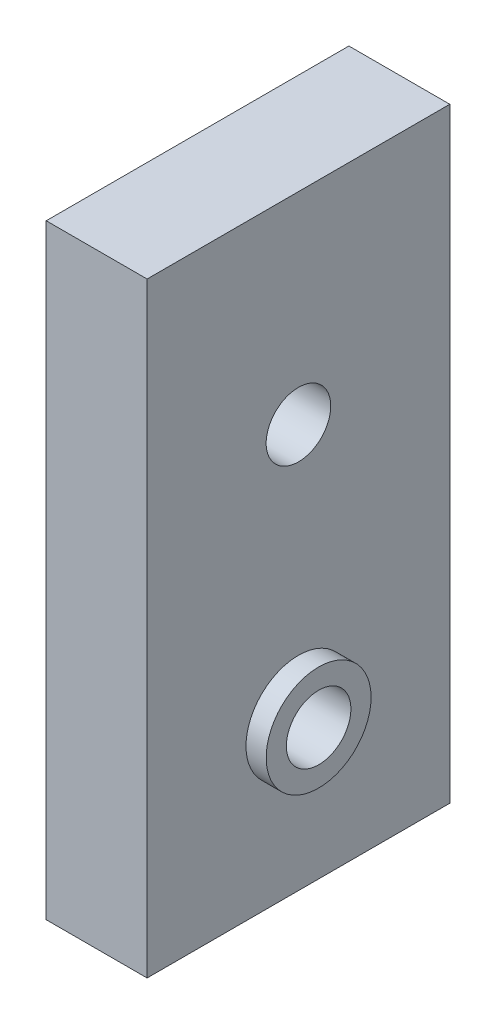
ISO-10303-21;
HEADER;
FILE_DESCRIPTION(('STEP AP214'),'2;1');
FILE_NAME('part.step','',(''),(''),'','','');
FILE_SCHEMA(('AUTOMOTIVE_DESIGN { 1 0 10303 214 1 1 1 1 }'));
ENDSEC;
DATA;
#1=APPLICATION_CONTEXT('core data for automotive mechanical design processes');
#2=APPLICATION_PROTOCOL_DEFINITION('international standard','automotive_design',2000,#1);
#3=PRODUCT_CONTEXT('',#1,'mechanical');
#4=PRODUCT('Part','Part','',(#3));
#5=PRODUCT_RELATED_PRODUCT_CATEGORY('part','',(#4));
#6=PRODUCT_DEFINITION_FORMATION('','',#4);
#7=PRODUCT_DEFINITION_CONTEXT('part definition',#1,'design');
#8=PRODUCT_DEFINITION('design','',#6,#7);
#9=PRODUCT_DEFINITION_SHAPE('','',#8);
#10=(LENGTH_UNIT() NAMED_UNIT(*) SI_UNIT(.MILLI.,.METRE.));
#11=(NAMED_UNIT(*) PLANE_ANGLE_UNIT() SI_UNIT($,.RADIAN.));
#12=(NAMED_UNIT(*) SI_UNIT($,.STERADIAN.) SOLID_ANGLE_UNIT());
#13=UNCERTAINTY_MEASURE_WITH_UNIT(LENGTH_MEASURE(1.E-05),#10,'distance_accuracy_value','');
#14=(GEOMETRIC_REPRESENTATION_CONTEXT(3) GLOBAL_UNCERTAINTY_ASSIGNED_CONTEXT((#13)) GLOBAL_UNIT_ASSIGNED_CONTEXT((#10,
#11,#12)) REPRESENTATION_CONTEXT('',''));
#15=CARTESIAN_POINT('',(0.,0.,0.));
#16=DIRECTION('',(0.,0.,1.));
#17=DIRECTION('',(1.,0.,0.));
#18=AXIS2_PLACEMENT_3D('',#15,#16,#17);
#19=CARTESIAN_POINT('',(5.,0.,0.));
#20=DIRECTION('',(1.,0.,0.));
#21=DIRECTION('',(0.,0.,-1.));
#22=AXIS2_PLACEMENT_3D('',#19,#20,#21);
#23=PLANE('',#22);
#24=CARTESIAN_POINT('',(5.,20.,-7.5));
#25=DIRECTION('',(1.,0.,0.));
#26=DIRECTION('',(0.,0.,-1.));
#27=AXIS2_PLACEMENT_3D('',#24,#25,#26);
#28=CIRCLE('',#27,1.6);
#29=CARTESIAN_POINT('',(5.,20.,-9.1));
#30=VERTEX_POINT('',#29);
#31=EDGE_CURVE('E105',#30,#30,#28,.T.);
#32=ORIENTED_EDGE('',*,*,#31,.F.);
#33=EDGE_LOOP('',(#32));
#34=FACE_BOUND('',#33,.T.);
#35=DIRECTION('',(0.,1.,0.));
#36=VECTOR('',#35,1.);
#37=CARTESIAN_POINT('',(5.,0.,0.));
#38=LINE('',#37,#36);
#39=CARTESIAN_POINT('',(5.,0.,0.));
#40=VERTEX_POINT('',#39);
#41=CARTESIAN_POINT('',(5.,30.,0.));
#42=VERTEX_POINT('',#41);
#43=EDGE_CURVE('E96',#40,#42,#38,.T.);
#44=ORIENTED_EDGE('',*,*,#43,.F.);
#45=DIRECTION('',(0.,0.,-1.));
#46=VECTOR('',#45,1.);
#47=CARTESIAN_POINT('',(5.,0.,0.));
#48=LINE('',#47,#46);
#49=CARTESIAN_POINT('',(5.,0.,-15.));
#50=VERTEX_POINT('',#49);
#51=EDGE_CURVE('E92',#40,#50,#48,.T.);
#52=ORIENTED_EDGE('',*,*,#51,.T.);
#53=DIRECTION('',(0.,1.,0.));
#54=VECTOR('',#53,1.);
#55=CARTESIAN_POINT('',(5.,0.,-15.));
#56=LINE('',#55,#54);
#57=CARTESIAN_POINT('',(5.,30.,-15.));
#58=VERTEX_POINT('',#57);
#59=EDGE_CURVE('E84',#50,#58,#56,.T.);
#60=ORIENTED_EDGE('',*,*,#59,.T.);
#61=DIRECTION('',(0.,0.,-1.));
#62=VECTOR('',#61,1.);
#63=CARTESIAN_POINT('',(5.,30.,0.));
#64=LINE('',#63,#62);
#65=EDGE_CURVE('E91',#42,#58,#64,.T.);
#66=ORIENTED_EDGE('',*,*,#65,.F.);
#67=EDGE_LOOP('',(#44,#52,#60,#66));
#68=FACE_BOUND('',#67,.T.);
#69=CARTESIAN_POINT('',(5.,7.5,-7.5));
#70=DIRECTION('',(1.,0.,0.));
#71=DIRECTION('',(0.,0.,-1.));
#72=AXIS2_PLACEMENT_3D('',#69,#70,#71);
#73=CIRCLE('',#72,2.6);
#74=CARTESIAN_POINT('',(5.,7.5,-10.1));
#75=VERTEX_POINT('',#74);
#76=EDGE_CURVE('E125',#75,#75,#73,.T.);
#77=ORIENTED_EDGE('',*,*,#76,.F.);
#78=EDGE_LOOP('',(#77));
#79=FACE_BOUND('',#78,.T.);
#80=ADVANCED_FACE('F41',(#34,#68,#79),#23,.T.);
#81=CARTESIAN_POINT('',(5.,0.,0.));
#82=DIRECTION('',(0.,0.,1.));
#83=DIRECTION('',(1.,0.,0.));
#84=AXIS2_PLACEMENT_3D('',#81,#82,#83);
#85=PLANE('',#84);
#86=DIRECTION('',(0.,1.,0.));
#87=VECTOR('',#86,1.);
#88=CARTESIAN_POINT('',(0.,0.,0.));
#89=LINE('',#88,#87);
#90=CARTESIAN_POINT('',(0.,0.,0.));
#91=VERTEX_POINT('',#90);
#92=CARTESIAN_POINT('',(0.,30.,0.));
#93=VERTEX_POINT('',#92);
#94=EDGE_CURVE('E115',#91,#93,#89,.T.);
#95=ORIENTED_EDGE('',*,*,#94,.F.);
#96=DIRECTION('',(-1.,0.,0.));
#97=VECTOR('',#96,1.);
#98=CARTESIAN_POINT('',(5.,0.,0.));
#99=LINE('',#98,#97);
#100=EDGE_CURVE('E12',#40,#91,#99,.T.);
#101=ORIENTED_EDGE('',*,*,#100,.F.);
#102=ORIENTED_EDGE('',*,*,#43,.T.);
#103=DIRECTION('',(-1.,0.,0.));
#104=VECTOR('',#103,1.);
#105=CARTESIAN_POINT('',(5.,30.,0.));
#106=LINE('',#105,#104);
#107=EDGE_CURVE('E58',#42,#93,#106,.T.);
#108=ORIENTED_EDGE('',*,*,#107,.T.);
#109=EDGE_LOOP('',(#95,#101,#102,#108));
#110=FACE_BOUND('',#109,.T.);
#111=ADVANCED_FACE('F151',(#110),#85,.T.);
#112=CARTESIAN_POINT('',(5.,0.,0.));
#113=DIRECTION('',(0.,1.,0.));
#114=DIRECTION('',(0.,0.,1.));
#115=AXIS2_PLACEMENT_3D('',#112,#113,#114);
#116=PLANE('',#115);
#117=DIRECTION('',(0.,0.,-1.));
#118=VECTOR('',#117,1.);
#119=CARTESIAN_POINT('',(0.,0.,0.));
#120=LINE('',#119,#118);
#121=CARTESIAN_POINT('',(0.,0.,-15.));
#122=VERTEX_POINT('',#121);
#123=EDGE_CURVE('E101',#91,#122,#120,.T.);
#124=ORIENTED_EDGE('',*,*,#123,.T.);
#125=DIRECTION('',(-1.,0.,0.));
#126=VECTOR('',#125,1.);
#127=CARTESIAN_POINT('',(5.,0.,-15.));
#128=LINE('',#127,#126);
#129=EDGE_CURVE('E50',#50,#122,#128,.T.);
#130=ORIENTED_EDGE('',*,*,#129,.F.);
#131=ORIENTED_EDGE('',*,*,#51,.F.);
#132=ORIENTED_EDGE('',*,*,#100,.T.);
#133=EDGE_LOOP('',(#124,#130,#131,#132));
#134=FACE_BOUND('',#133,.T.);
#135=ADVANCED_FACE('F99',(#134),#116,.F.);
#136=CARTESIAN_POINT('',(5.,0.,-15.));
#137=DIRECTION('',(0.,0.,1.));
#138=DIRECTION('',(1.,0.,0.));
#139=AXIS2_PLACEMENT_3D('',#136,#137,#138);
#140=PLANE('',#139);
#141=DIRECTION('',(0.,1.,0.));
#142=VECTOR('',#141,1.);
#143=CARTESIAN_POINT('',(0.,0.,-15.));
#144=LINE('',#143,#142);
#145=CARTESIAN_POINT('',(0.,30.,-15.));
#146=VERTEX_POINT('',#145);
#147=EDGE_CURVE('E112',#122,#146,#144,.T.);
#148=ORIENTED_EDGE('',*,*,#147,.T.);
#149=DIRECTION('',(-1.,0.,0.));
#150=VECTOR('',#149,1.);
#151=CARTESIAN_POINT('',(5.,30.,-15.));
#152=LINE('',#151,#150);
#153=EDGE_CURVE('E72',#58,#146,#152,.T.);
#154=ORIENTED_EDGE('',*,*,#153,.F.);
#155=ORIENTED_EDGE('',*,*,#59,.F.);
#156=ORIENTED_EDGE('',*,*,#129,.T.);
#157=EDGE_LOOP('',(#148,#154,#155,#156));
#158=FACE_BOUND('',#157,.T.);
#159=ADVANCED_FACE('F86',(#158),#140,.F.);
#160=CARTESIAN_POINT('',(5.,30.,0.));
#161=DIRECTION('',(0.,1.,0.));
#162=DIRECTION('',(0.,0.,1.));
#163=AXIS2_PLACEMENT_3D('',#160,#161,#162);
#164=PLANE('',#163);
#165=DIRECTION('',(0.,0.,-1.));
#166=VECTOR('',#165,1.);
#167=CARTESIAN_POINT('',(0.,30.,0.));
#168=LINE('',#167,#166);
#169=EDGE_CURVE('E109',#93,#146,#168,.T.);
#170=ORIENTED_EDGE('',*,*,#169,.F.);
#171=ORIENTED_EDGE('',*,*,#107,.F.);
#172=ORIENTED_EDGE('',*,*,#65,.T.);
#173=ORIENTED_EDGE('',*,*,#153,.T.);
#174=EDGE_LOOP('',(#170,#171,#172,#173));
#175=FACE_BOUND('',#174,.T.);
#176=ADVANCED_FACE('F162',(#175),#164,.T.);
#177=CARTESIAN_POINT('',(5.,7.5,-7.5));
#178=DIRECTION('',(-1.,0.,0.));
#179=DIRECTION('',(0.,0.,1.));
#180=AXIS2_PLACEMENT_3D('',#177,#178,#179);
#181=CYLINDRICAL_SURFACE('',#180,1.6);
#182=CARTESIAN_POINT('',(0.,7.5,-7.5));
#183=DIRECTION('',(1.,0.,0.));
#184=DIRECTION('',(0.,0.,-1.));
#185=AXIS2_PLACEMENT_3D('',#182,#183,#184);
#186=CIRCLE('',#185,1.6);
#187=CARTESIAN_POINT('',(0.,7.5,-9.1));
#188=VERTEX_POINT('',#187);
#189=EDGE_CURVE('E117',#188,#188,#186,.T.);
#190=ORIENTED_EDGE('',*,*,#189,.F.);
#191=EDGE_LOOP('',(#190));
#192=FACE_BOUND('',#191,.T.);
#193=CARTESIAN_POINT('',(6.,7.5,-7.5));
#194=DIRECTION('',(1.,0.,0.));
#195=DIRECTION('',(0.,0.,-1.));
#196=AXIS2_PLACEMENT_3D('',#193,#194,#195);
#197=CIRCLE('',#196,1.6);
#198=CARTESIAN_POINT('',(6.,7.5,-9.1));
#199=VERTEX_POINT('',#198);
#200=EDGE_CURVE('E128',#199,#199,#197,.T.);
#201=ORIENTED_EDGE('',*,*,#200,.T.);
#202=EDGE_LOOP('',(#201));
#203=FACE_BOUND('',#202,.T.);
#204=ADVANCED_FACE('F43',(#192,#203),#181,.F.);
#205=CARTESIAN_POINT('',(5.,20.,-7.5));
#206=DIRECTION('',(-1.,0.,0.));
#207=DIRECTION('',(0.,0.,1.));
#208=AXIS2_PLACEMENT_3D('',#205,#206,#207);
#209=CYLINDRICAL_SURFACE('',#208,1.6);
#210=ORIENTED_EDGE('',*,*,#31,.T.);
#211=EDGE_LOOP('',(#210));
#212=FACE_BOUND('',#211,.T.);
#213=CARTESIAN_POINT('',(0.,20.,-7.5));
#214=DIRECTION('',(1.,0.,0.));
#215=DIRECTION('',(0.,0.,-1.));
#216=AXIS2_PLACEMENT_3D('',#213,#214,#215);
#217=CIRCLE('',#216,1.6);
#218=CARTESIAN_POINT('',(0.,20.,-9.1));
#219=VERTEX_POINT('',#218);
#220=EDGE_CURVE('E106',#219,#219,#217,.T.);
#221=ORIENTED_EDGE('',*,*,#220,.F.);
#222=EDGE_LOOP('',(#221));
#223=FACE_BOUND('',#222,.T.);
#224=ADVANCED_FACE('F147',(#212,#223),#209,.F.);
#225=CARTESIAN_POINT('',(0.,0.,0.));
#226=DIRECTION('',(1.,0.,0.));
#227=DIRECTION('',(0.,0.,-1.));
#228=AXIS2_PLACEMENT_3D('',#225,#226,#227);
#229=PLANE('',#228);
#230=ORIENTED_EDGE('',*,*,#189,.T.);
#231=EDGE_LOOP('',(#230));
#232=FACE_BOUND('',#231,.T.);
#233=ORIENTED_EDGE('',*,*,#94,.T.);
#234=ORIENTED_EDGE('',*,*,#169,.T.);
#235=ORIENTED_EDGE('',*,*,#147,.F.);
#236=ORIENTED_EDGE('',*,*,#123,.F.);
#237=EDGE_LOOP('',(#233,#234,#235,#236));
#238=FACE_BOUND('',#237,.T.);
#239=ORIENTED_EDGE('',*,*,#220,.T.);
#240=EDGE_LOOP('',(#239));
#241=FACE_BOUND('',#240,.T.);
#242=ADVANCED_FACE('F138',(#232,#238,#241),#229,.F.);
#243=CARTESIAN_POINT('',(6.,7.5,-7.5));
#244=DIRECTION('',(1.,0.,0.));
#245=DIRECTION('',(0.,0.,-1.));
#246=AXIS2_PLACEMENT_3D('',#243,#244,#245);
#247=PLANE('',#246);
#248=CARTESIAN_POINT('',(6.,7.5,-7.5));
#249=DIRECTION('',(1.,0.,0.));
#250=DIRECTION('',(0.,0.,-1.));
#251=AXIS2_PLACEMENT_3D('',#248,#249,#250);
#252=CIRCLE('',#251,2.6);
#253=CARTESIAN_POINT('',(6.,7.5,-10.1));
#254=VERTEX_POINT('',#253);
#255=EDGE_CURVE('E120',#254,#254,#252,.T.);
#256=ORIENTED_EDGE('',*,*,#255,.T.);
#257=EDGE_LOOP('',(#256));
#258=FACE_BOUND('',#257,.T.);
#259=ORIENTED_EDGE('',*,*,#200,.F.);
#260=EDGE_LOOP('',(#259));
#261=FACE_BOUND('',#260,.T.);
#262=ADVANCED_FACE('F135',(#258,#261),#247,.T.);
#263=CARTESIAN_POINT('',(6.,7.5,-7.5));
#264=DIRECTION('',(-1.,0.,0.));
#265=DIRECTION('',(0.,0.,1.));
#266=AXIS2_PLACEMENT_3D('',#263,#264,#265);
#267=CYLINDRICAL_SURFACE('',#266,2.6);
#268=ORIENTED_EDGE('',*,*,#255,.F.);
#269=EDGE_LOOP('',(#268));
#270=FACE_BOUND('',#269,.T.);
#271=ORIENTED_EDGE('',*,*,#76,.T.);
#272=EDGE_LOOP('',(#271));
#273=FACE_BOUND('',#272,.T.);
#274=ADVANCED_FACE('F137',(#270,#273),#267,.T.);
#275=CLOSED_SHELL('',(#80,#111,#135,#159,#176,#204,#224,#242,#262,#274));
#276=MANIFOLD_SOLID_BREP('B2',#275);
#277=ADVANCED_BREP_SHAPE_REPRESENTATION('',(#18,#276),#14);
#278=SHAPE_DEFINITION_REPRESENTATION(#9,#277);
ENDSEC;
END-ISO-10303-21;
